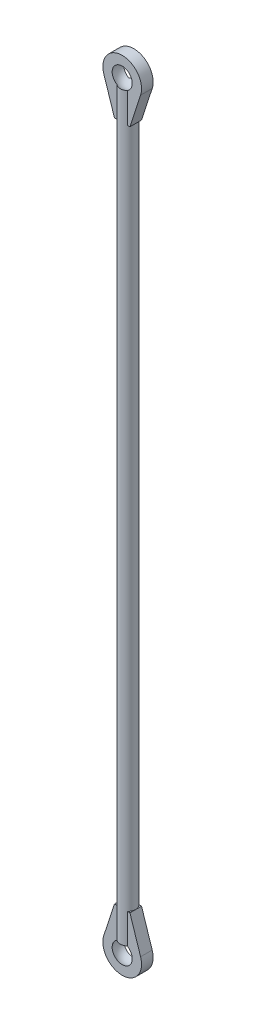
ISO-10303-21;
HEADER;
FILE_DESCRIPTION(('STEP AP214'),'2;1');
FILE_NAME('part.step','',(''),(''),'','','');
FILE_SCHEMA(('AUTOMOTIVE_DESIGN { 1 0 10303 214 1 1 1 1 }'));
ENDSEC;
DATA;
#1=APPLICATION_CONTEXT('core data for automotive mechanical design processes');
#2=APPLICATION_PROTOCOL_DEFINITION('international standard','automotive_design',2000,#1);
#3=PRODUCT_CONTEXT('',#1,'mechanical');
#4=PRODUCT('Part','Part','',(#3));
#5=PRODUCT_RELATED_PRODUCT_CATEGORY('part','',(#4));
#6=PRODUCT_DEFINITION_FORMATION('','',#4);
#7=PRODUCT_DEFINITION_CONTEXT('part definition',#1,'design');
#8=PRODUCT_DEFINITION('design','',#6,#7);
#9=PRODUCT_DEFINITION_SHAPE('','',#8);
#10=(LENGTH_UNIT() NAMED_UNIT(*) SI_UNIT(.MILLI.,.METRE.));
#11=(NAMED_UNIT(*) PLANE_ANGLE_UNIT() SI_UNIT($,.RADIAN.));
#12=(NAMED_UNIT(*) SI_UNIT($,.STERADIAN.) SOLID_ANGLE_UNIT());
#13=UNCERTAINTY_MEASURE_WITH_UNIT(LENGTH_MEASURE(1.E-05),#10,'distance_accuracy_value','');
#14=(GEOMETRIC_REPRESENTATION_CONTEXT(3) GLOBAL_UNCERTAINTY_ASSIGNED_CONTEXT((#13)) GLOBAL_UNIT_ASSIGNED_CONTEXT((#10,
#11,#12)) REPRESENTATION_CONTEXT('',''));
#15=CARTESIAN_POINT('',(0.,0.,0.));
#16=DIRECTION('',(0.,0.,1.));
#17=DIRECTION('',(1.,0.,0.));
#18=AXIS2_PLACEMENT_3D('',#15,#16,#17);
#19=CARTESIAN_POINT('',(0.,-98.,0.));
#20=DIRECTION('',(0.,-1.,0.));
#21=DIRECTION('',(1.,0.,0.));
#22=AXIS2_PLACEMENT_3D('',#19,#20,#21);
#23=CYLINDRICAL_SURFACE('',#22,2.00000000000002);
#24=DIRECTION('',(0.,-1.,0.));
#25=VECTOR('',#24,1.);
#26=CARTESIAN_POINT('',(-1.32287565553233,-98.,-1.5));
#27=LINE('',#26,#25);
#28=CARTESIAN_POINT('',(-1.32287565553237,88.,-1.5));
#29=VERTEX_POINT('',#28);
#30=CARTESIAN_POINT('',(-1.32287565553237,95.7639320225002,-1.5));
#31=VERTEX_POINT('',#30);
#32=EDGE_CURVE('E276',#29,#31,#27,.F.);
#33=ORIENTED_EDGE('',*,*,#32,.T.);
#34=CARTESIAN_POINT('',(0.,95.7639320225002,0.));
#35=DIRECTION('',(0.,0.999999999999999,0.));
#36=DIRECTION('',(-1.,0.,0.));
#37=AXIS2_PLACEMENT_3D('',#34,#35,#36);
#38=CIRCLE('',#37,2.00000000000002);
#39=CARTESIAN_POINT('',(1.3228756555323,95.7639320225002,-1.5));
#40=VERTEX_POINT('',#39);
#41=EDGE_CURVE('E224',#31,#40,#38,.F.);
#42=ORIENTED_EDGE('',*,*,#41,.T.);
#43=DIRECTION('',(0.,-1.,0.));
#44=VECTOR('',#43,1.);
#45=CARTESIAN_POINT('',(1.32287565553233,-98.,-1.5));
#46=LINE('',#45,#44);
#47=CARTESIAN_POINT('',(1.3228756555323,88.,-1.5));
#48=VERTEX_POINT('',#47);
#49=EDGE_CURVE('E270',#40,#48,#46,.T.);
#50=ORIENTED_EDGE('',*,*,#49,.T.);
#51=CARTESIAN_POINT('',(0.,88.,0.));
#52=DIRECTION('',(0.,1.,0.));
#53=DIRECTION('',(0.,0.,1.));
#54=AXIS2_PLACEMENT_3D('',#51,#52,#53);
#55=CIRCLE('',#54,2.00000000000002);
#56=CARTESIAN_POINT('',(2.00000000000002,88.,0.));
#57=VERTEX_POINT('',#56);
#58=EDGE_CURVE('E268',#48,#57,#55,.F.);
#59=ORIENTED_EDGE('',*,*,#58,.T.);
#60=CARTESIAN_POINT('',(1.3228756555323,88.,1.5));
#61=VERTEX_POINT('',#60);
#62=EDGE_CURVE('E265',#57,#61,#55,.F.);
#63=ORIENTED_EDGE('',*,*,#62,.T.);
#64=DIRECTION('',(0.,-1.,0.));
#65=VECTOR('',#64,1.);
#66=CARTESIAN_POINT('',(1.32287565553233,-98.,1.5));
#67=LINE('',#66,#65);
#68=CARTESIAN_POINT('',(1.3228756555323,95.7639320225002,1.5));
#69=VERTEX_POINT('',#68);
#70=EDGE_CURVE('E258',#69,#61,#67,.T.);
#71=ORIENTED_EDGE('',*,*,#70,.F.);
#72=CARTESIAN_POINT('',(-1.32287565553237,95.7639320225002,1.5));
#73=VERTEX_POINT('',#72);
#74=EDGE_CURVE('E220',#69,#73,#38,.F.);
#75=ORIENTED_EDGE('',*,*,#74,.T.);
#76=DIRECTION('',(0.,-1.,0.));
#77=VECTOR('',#76,1.);
#78=CARTESIAN_POINT('',(-1.32287565553233,-98.,1.5));
#79=LINE('',#78,#77);
#80=CARTESIAN_POINT('',(-1.32287565553237,88.,1.5));
#81=VERTEX_POINT('',#80);
#82=EDGE_CURVE('E272',#81,#73,#79,.F.);
#83=ORIENTED_EDGE('',*,*,#82,.F.);
#84=CARTESIAN_POINT('',(-2.00000000000006,88.,0.));
#85=VERTEX_POINT('',#84);
#86=EDGE_CURVE('E275',#81,#85,#55,.F.);
#87=ORIENTED_EDGE('',*,*,#86,.T.);
#88=EDGE_CURVE('E269',#85,#29,#55,.F.);
#89=ORIENTED_EDGE('',*,*,#88,.T.);
#90=EDGE_LOOP('',(#33,#42,#50,#59,#63,#71,#75,#83,#87,#89));
#91=FACE_BOUND('',#90,.T.);
#92=DIRECTION('',(0.,-1.,0.));
#93=VECTOR('',#92,1.);
#94=CARTESIAN_POINT('',(1.32287565553233,-98.,-1.5));
#95=LINE('',#94,#93);
#96=CARTESIAN_POINT('',(1.32287565553233,-88.,-1.5));
#97=VERTEX_POINT('',#96);
#98=CARTESIAN_POINT('',(1.32287565553233,-95.7639320225002,-1.5));
#99=VERTEX_POINT('',#98);
#100=EDGE_CURVE('E202',#97,#99,#95,.T.);
#101=ORIENTED_EDGE('',*,*,#100,.T.);
#102=CARTESIAN_POINT('',(0.,-95.7639320225002,0.));
#103=DIRECTION('',(0.,-0.999999999999999,0.));
#104=DIRECTION('',(1.,0.,0.));
#105=AXIS2_PLACEMENT_3D('',#102,#103,#104);
#106=CIRCLE('',#105,2.00000000000002);
#107=CARTESIAN_POINT('',(-1.32287565553233,-95.7639320225002,-1.5));
#108=VERTEX_POINT('',#107);
#109=EDGE_CURVE('E92',#99,#108,#106,.F.);
#110=ORIENTED_EDGE('',*,*,#109,.T.);
#111=DIRECTION('',(0.,-1.,0.));
#112=VECTOR('',#111,1.);
#113=CARTESIAN_POINT('',(-1.32287565553233,-98.,-1.5));
#114=LINE('',#113,#112);
#115=CARTESIAN_POINT('',(-1.32287565553233,-88.,-1.5));
#116=VERTEX_POINT('',#115);
#117=EDGE_CURVE('E199',#108,#116,#114,.F.);
#118=ORIENTED_EDGE('',*,*,#117,.T.);
#119=CARTESIAN_POINT('',(0.,-88.,0.));
#120=DIRECTION('',(0.,1.,0.));
#121=DIRECTION('',(0.,0.,1.));
#122=AXIS2_PLACEMENT_3D('',#119,#120,#121);
#123=CIRCLE('',#122,2.00000000000002);
#124=CARTESIAN_POINT('',(-2.00000000000003,-87.9999999999999,0.));
#125=VERTEX_POINT('',#124);
#126=EDGE_CURVE('E286',#125,#116,#123,.F.);
#127=ORIENTED_EDGE('',*,*,#126,.F.);
#128=CARTESIAN_POINT('',(-1.32287565553233,-88.,1.5));
#129=VERTEX_POINT('',#128);
#130=EDGE_CURVE('E80',#129,#125,#123,.F.);
#131=ORIENTED_EDGE('',*,*,#130,.F.);
#132=DIRECTION('',(0.,-1.,0.));
#133=VECTOR('',#132,1.);
#134=CARTESIAN_POINT('',(-1.32287565553233,-98.,1.5));
#135=LINE('',#134,#133);
#136=CARTESIAN_POINT('',(-1.32287565553233,-95.7639320225002,1.5));
#137=VERTEX_POINT('',#136);
#138=EDGE_CURVE('E213',#137,#129,#135,.F.);
#139=ORIENTED_EDGE('',*,*,#138,.F.);
#140=CARTESIAN_POINT('',(1.32287565553233,-95.7639320225002,1.5));
#141=VERTEX_POINT('',#140);
#142=EDGE_CURVE('E86',#137,#141,#106,.F.);
#143=ORIENTED_EDGE('',*,*,#142,.T.);
#144=DIRECTION('',(0.,-1.,0.));
#145=VECTOR('',#144,1.);
#146=CARTESIAN_POINT('',(1.32287565553233,-98.,1.5));
#147=LINE('',#146,#145);
#148=CARTESIAN_POINT('',(1.32287565553233,-88.,1.5));
#149=VERTEX_POINT('',#148);
#150=EDGE_CURVE('E210',#149,#141,#147,.T.);
#151=ORIENTED_EDGE('',*,*,#150,.F.);
#152=CARTESIAN_POINT('',(2.00000000000002,-88.,0.));
#153=VERTEX_POINT('',#152);
#154=EDGE_CURVE('E282',#153,#149,#123,.F.);
#155=ORIENTED_EDGE('',*,*,#154,.F.);
#156=EDGE_CURVE('E281',#97,#153,#123,.F.);
#157=ORIENTED_EDGE('',*,*,#156,.F.);
#158=EDGE_LOOP('',(#101,#110,#118,#127,#131,#139,#143,#151,#155,#157));
#159=FACE_BOUND('',#158,.T.);
#160=ADVANCED_FACE('F73',(#91,#159),#23,.T.);
#161=CARTESIAN_POINT('',(0.,88.,1.5));
#162=DIRECTION('',(0.,1.,0.));
#163=DIRECTION('',(0.,0.,1.));
#164=AXIS2_PLACEMENT_3D('',#161,#162,#163);
#165=PLANE('',#164);
#166=ORIENTED_EDGE('',*,*,#86,.F.);
#167=DIRECTION('',(1.,0.,0.));
#168=VECTOR('',#167,1.);
#169=CARTESIAN_POINT('',(0.,88.,1.5));
#170=LINE('',#169,#168);
#171=CARTESIAN_POINT('',(-2.00000000000006,88.,1.5));
#172=VERTEX_POINT('',#171);
#173=EDGE_CURVE('E230',#172,#81,#170,.T.);
#174=ORIENTED_EDGE('',*,*,#173,.F.);
#175=DIRECTION('',(0.,0.,-1.));
#176=VECTOR('',#175,1.);
#177=CARTESIAN_POINT('',(-2.00000000000006,88.,1.5));
#178=LINE('',#177,#176);
#179=EDGE_CURVE('E253',#172,#85,#178,.T.);
#180=ORIENTED_EDGE('',*,*,#179,.T.);
#181=EDGE_LOOP('',(#166,#174,#180));
#182=FACE_BOUND('',#181,.T.);
#183=ADVANCED_FACE('F359',(#182),#165,.F.);
#184=ORIENTED_EDGE('',*,*,#88,.F.);
#185=CARTESIAN_POINT('',(-2.00000000000006,88.,-1.5));
#186=VERTEX_POINT('',#185);
#187=EDGE_CURVE('E252',#85,#186,#178,.T.);
#188=ORIENTED_EDGE('',*,*,#187,.T.);
#189=DIRECTION('',(1.,0.,0.));
#190=VECTOR('',#189,1.);
#191=CARTESIAN_POINT('',(0.,88.,-1.5));
#192=LINE('',#191,#190);
#193=EDGE_CURVE('E242',#186,#29,#192,.T.);
#194=ORIENTED_EDGE('',*,*,#193,.T.);
#195=EDGE_LOOP('',(#184,#188,#194));
#196=FACE_BOUND('',#195,.T.);
#197=ADVANCED_FACE('F364',(#196),#165,.F.);
#198=ORIENTED_EDGE('',*,*,#58,.F.);
#199=CARTESIAN_POINT('',(2.00000000000002,88.,-1.5));
#200=VERTEX_POINT('',#199);
#201=EDGE_CURVE('E240',#48,#200,#192,.T.);
#202=ORIENTED_EDGE('',*,*,#201,.T.);
#203=DIRECTION('',(0.,0.,-1.));
#204=VECTOR('',#203,1.);
#205=CARTESIAN_POINT('',(2.00000000000002,88.,1.5));
#206=LINE('',#205,#204);
#207=EDGE_CURVE('E248',#57,#200,#206,.T.);
#208=ORIENTED_EDGE('',*,*,#207,.F.);
#209=EDGE_LOOP('',(#198,#202,#208));
#210=FACE_BOUND('',#209,.T.);
#211=ADVANCED_FACE('F396',(#210),#165,.F.);
#212=CARTESIAN_POINT('',(24.1163142030769,7.85901549691378,1.5));
#213=DIRECTION('',(0.950787924741885,0.309842415051618,0.));
#214=DIRECTION('',(-0.309842415051618,0.950787924741885,0.));
#215=AXIS2_PLACEMENT_3D('',#212,#213,#214);
#216=PLANE('',#215);
#217=DIRECTION('',(0.309842415051618,-0.950787924741885,0.));
#218=VECTOR('',#217,1.);
#219=CARTESIAN_POINT('',(24.1163142030769,7.85901549691378,-1.5));
#220=LINE('',#219,#218);
#221=CARTESIAN_POINT('',(-4.75393962370943,96.4507879247419,-1.5));
#222=VERTEX_POINT('',#221);
#223=EDGE_CURVE('E237',#222,#186,#220,.T.);
#224=ORIENTED_EDGE('',*,*,#223,.T.);
#225=ORIENTED_EDGE('',*,*,#187,.F.);
#226=ORIENTED_EDGE('',*,*,#179,.F.);
#227=DIRECTION('',(0.309842415051618,-0.950787924741885,0.));
#228=VECTOR('',#227,1.);
#229=CARTESIAN_POINT('',(24.1163142030769,7.85901549691378,1.5));
#230=LINE('',#229,#228);
#231=CARTESIAN_POINT('',(-4.75393962370943,96.4507879247419,1.5));
#232=VERTEX_POINT('',#231);
#233=EDGE_CURVE('E226',#232,#172,#230,.T.);
#234=ORIENTED_EDGE('',*,*,#233,.F.);
#235=DIRECTION('',(0.,0.,-1.));
#236=VECTOR('',#235,1.);
#237=CARTESIAN_POINT('',(-4.75393962370943,96.4507879247419,1.5));
#238=LINE('',#237,#236);
#239=EDGE_CURVE('E256',#232,#222,#238,.T.);
#240=ORIENTED_EDGE('',*,*,#239,.T.);
#241=EDGE_LOOP('',(#224,#225,#226,#234,#240));
#242=FACE_BOUND('',#241,.T.);
#243=ADVANCED_FACE('F381',(#242),#216,.F.);
#244=ORIENTED_EDGE('',*,*,#62,.F.);
#245=CARTESIAN_POINT('',(2.00000000000002,88.,1.5));
#246=VERTEX_POINT('',#245);
#247=EDGE_CURVE('E249',#246,#57,#206,.T.);
#248=ORIENTED_EDGE('',*,*,#247,.F.);
#249=EDGE_CURVE('E228',#61,#246,#170,.T.);
#250=ORIENTED_EDGE('',*,*,#249,.F.);
#251=EDGE_LOOP('',(#244,#248,#250));
#252=FACE_BOUND('',#251,.T.);
#253=ADVANCED_FACE('F367',(#252),#165,.F.);
#254=CARTESIAN_POINT('',(-24.1163142030771,7.85901549691395,1.5));
#255=DIRECTION('',(-0.950787924741884,0.309842415051621,0.));
#256=DIRECTION('',(-0.309842415051621,-0.950787924741884,0.));
#257=AXIS2_PLACEMENT_3D('',#254,#255,#256);
#258=PLANE('',#257);
#259=DIRECTION('',(0.309842415051621,0.950787924741884,0.));
#260=VECTOR('',#259,1.);
#261=CARTESIAN_POINT('',(-24.1163142030771,7.85901549691395,-1.5));
#262=LINE('',#261,#260);
#263=CARTESIAN_POINT('',(4.75393962370942,96.4507879247419,-1.5));
#264=VERTEX_POINT('',#263);
#265=EDGE_CURVE('E229',#200,#264,#262,.T.);
#266=ORIENTED_EDGE('',*,*,#265,.T.);
#267=DIRECTION('',(0.,0.,-1.));
#268=VECTOR('',#267,1.);
#269=CARTESIAN_POINT('',(4.75393962370942,96.4507879247419,1.5));
#270=LINE('',#269,#268);
#271=CARTESIAN_POINT('',(4.75393962370942,96.4507879247419,1.5));
#272=VERTEX_POINT('',#271);
#273=EDGE_CURVE('E236',#272,#264,#270,.T.);
#274=ORIENTED_EDGE('',*,*,#273,.F.);
#275=DIRECTION('',(0.309842415051621,0.950787924741884,0.));
#276=VECTOR('',#275,1.);
#277=CARTESIAN_POINT('',(-24.1163142030771,7.85901549691395,1.5));
#278=LINE('',#277,#276);
#279=EDGE_CURVE('E233',#246,#272,#278,.T.);
#280=ORIENTED_EDGE('',*,*,#279,.F.);
#281=ORIENTED_EDGE('',*,*,#247,.T.);
#282=ORIENTED_EDGE('',*,*,#207,.T.);
#283=EDGE_LOOP('',(#266,#274,#280,#281,#282));
#284=FACE_BOUND('',#283,.T.);
#285=ADVANCED_FACE('F388',(#284),#258,.F.);
#286=CARTESIAN_POINT('',(0.,0.,-1.5));
#287=DIRECTION('',(0.,0.,1.));
#288=DIRECTION('',(1.,0.,0.));
#289=AXIS2_PLACEMENT_3D('',#286,#287,#288);
#290=PLANE('',#289);
#291=CARTESIAN_POINT('',(0.,98.,-1.5));
#292=DIRECTION('',(0.,0.,1.));
#293=DIRECTION('',(1.,0.,0.));
#294=AXIS2_PLACEMENT_3D('',#291,#292,#293);
#295=CIRCLE('',#294,2.59807621135332);
#296=EDGE_CURVE('E223',#31,#40,#295,.F.);
#297=ORIENTED_EDGE('',*,*,#296,.F.);
#298=ORIENTED_EDGE('',*,*,#32,.F.);
#299=ORIENTED_EDGE('',*,*,#193,.F.);
#300=ORIENTED_EDGE('',*,*,#223,.F.);
#301=CARTESIAN_POINT('',(0.,98.,-1.5));
#302=DIRECTION('',(0.,0.,1.));
#303=DIRECTION('',(1.,0.,0.));
#304=AXIS2_PLACEMENT_3D('',#301,#302,#303);
#305=CIRCLE('',#304,5.);
#306=EDGE_CURVE('E261',#264,#222,#305,.T.);
#307=ORIENTED_EDGE('',*,*,#306,.F.);
#308=ORIENTED_EDGE('',*,*,#265,.F.);
#309=ORIENTED_EDGE('',*,*,#201,.F.);
#310=ORIENTED_EDGE('',*,*,#49,.F.);
#311=EDGE_LOOP('',(#297,#298,#299,#300,#307,#308,#309,#310));
#312=FACE_BOUND('',#311,.T.);
#313=ADVANCED_FACE('F375',(#312),#290,.F.);
#314=CARTESIAN_POINT('',(0.,0.,1.5));
#315=DIRECTION('',(0.,0.,1.));
#316=DIRECTION('',(1.,0.,0.));
#317=AXIS2_PLACEMENT_3D('',#314,#315,#316);
#318=PLANE('',#317);
#319=ORIENTED_EDGE('',*,*,#82,.T.);
#320=CARTESIAN_POINT('',(0.,98.,1.5));
#321=DIRECTION('',(0.,0.,1.));
#322=DIRECTION('',(1.,0.,0.));
#323=AXIS2_PLACEMENT_3D('',#320,#321,#322);
#324=CIRCLE('',#323,2.59807621135332);
#325=EDGE_CURVE('E279',#73,#69,#324,.F.);
#326=ORIENTED_EDGE('',*,*,#325,.T.);
#327=ORIENTED_EDGE('',*,*,#70,.T.);
#328=ORIENTED_EDGE('',*,*,#249,.T.);
#329=ORIENTED_EDGE('',*,*,#279,.T.);
#330=CARTESIAN_POINT('',(0.,98.,1.5));
#331=DIRECTION('',(0.,0.,1.));
#332=DIRECTION('',(1.,0.,0.));
#333=AXIS2_PLACEMENT_3D('',#330,#331,#332);
#334=CIRCLE('',#333,5.);
#335=EDGE_CURVE('E241',#272,#232,#334,.T.);
#336=ORIENTED_EDGE('',*,*,#335,.T.);
#337=ORIENTED_EDGE('',*,*,#233,.T.);
#338=ORIENTED_EDGE('',*,*,#173,.T.);
#339=EDGE_LOOP('',(#319,#326,#327,#328,#329,#336,#337,#338));
#340=FACE_BOUND('',#339,.T.);
#341=ADVANCED_FACE('F402',(#340),#318,.T.);
#342=CARTESIAN_POINT('',(0.,98.,1.5));
#343=DIRECTION('',(0.,0.,-1.));
#344=DIRECTION('',(-1.,0.,0.));
#345=AXIS2_PLACEMENT_3D('',#342,#343,#344);
#346=CYLINDRICAL_SURFACE('',#345,5.);
#347=ORIENTED_EDGE('',*,*,#306,.T.);
#348=ORIENTED_EDGE('',*,*,#239,.F.);
#349=ORIENTED_EDGE('',*,*,#335,.F.);
#350=ORIENTED_EDGE('',*,*,#273,.T.);
#351=EDGE_LOOP('',(#347,#348,#349,#350));
#352=FACE_BOUND('',#351,.T.);
#353=ADVANCED_FACE('F406',(#352),#346,.T.);
#354=CARTESIAN_POINT('',(0.,98.,0.));
#355=DIRECTION('',(0.,-1.,0.));
#356=DIRECTION('',(-1.,0.,0.));
#357=AXIS2_PLACEMENT_3D('',#354,#355,#356);
#358=SPHERICAL_SURFACE('',#357,3.);
#359=ORIENTED_EDGE('',*,*,#296,.T.);
#360=ORIENTED_EDGE('',*,*,#41,.F.);
#361=EDGE_LOOP('',(#359,#360));
#362=FACE_BOUND('',#361,.T.);
#363=ORIENTED_EDGE('',*,*,#325,.F.);
#364=ORIENTED_EDGE('',*,*,#74,.F.);
#365=EDGE_LOOP('',(#363,#364));
#366=FACE_BOUND('',#365,.T.);
#367=ADVANCED_FACE('F408',(#362,#366),#358,.F.);
#368=CARTESIAN_POINT('',(0.,-88.,1.5));
#369=DIRECTION('',(0.,1.,0.));
#370=DIRECTION('',(0.,0.,1.));
#371=AXIS2_PLACEMENT_3D('',#368,#369,#370);
#372=PLANE('',#371);
#373=DIRECTION('',(1.,0.,0.));
#374=VECTOR('',#373,1.);
#375=CARTESIAN_POINT('',(0.,-88.,1.5));
#376=LINE('',#375,#374);
#377=CARTESIAN_POINT('',(-2.00000000000006,-88.,1.5));
#378=VERTEX_POINT('',#377);
#379=EDGE_CURVE('E301',#378,#129,#376,.T.);
#380=ORIENTED_EDGE('',*,*,#379,.T.);
#381=ORIENTED_EDGE('',*,*,#130,.T.);
#382=DIRECTION('',(0.,0.,-1.));
#383=VECTOR('',#382,1.);
#384=CARTESIAN_POINT('',(-2.00000000000006,-88.,1.5));
#385=LINE('',#384,#383);
#386=EDGE_CURVE('E304',#378,#125,#385,.T.);
#387=ORIENTED_EDGE('',*,*,#386,.F.);
#388=EDGE_LOOP('',(#380,#381,#387));
#389=FACE_BOUND('',#388,.T.);
#390=ADVANCED_FACE('F303',(#389),#372,.T.);
#391=CARTESIAN_POINT('',(-2.00000000000006,-88.,-1.5));
#392=VERTEX_POINT('',#391);
#393=EDGE_CURVE('E293',#125,#392,#385,.T.);
#394=ORIENTED_EDGE('',*,*,#393,.F.);
#395=ORIENTED_EDGE('',*,*,#126,.T.);
#396=DIRECTION('',(1.,0.,0.));
#397=VECTOR('',#396,1.);
#398=CARTESIAN_POINT('',(0.,-88.,-1.5));
#399=LINE('',#398,#397);
#400=EDGE_CURVE('E209',#392,#116,#399,.T.);
#401=ORIENTED_EDGE('',*,*,#400,.F.);
#402=EDGE_LOOP('',(#394,#395,#401));
#403=FACE_BOUND('',#402,.T.);
#404=ADVANCED_FACE('F292',(#403),#372,.T.);
#405=CARTESIAN_POINT('',(2.00000000000002,-88.,-1.5));
#406=VERTEX_POINT('',#405);
#407=EDGE_CURVE('E316',#97,#406,#399,.T.);
#408=ORIENTED_EDGE('',*,*,#407,.F.);
#409=ORIENTED_EDGE('',*,*,#156,.T.);
#410=DIRECTION('',(0.,0.,-1.));
#411=VECTOR('',#410,1.);
#412=CARTESIAN_POINT('',(2.00000000000002,-88.,1.5));
#413=LINE('',#412,#411);
#414=EDGE_CURVE('E324',#153,#406,#413,.T.);
#415=ORIENTED_EDGE('',*,*,#414,.T.);
#416=EDGE_LOOP('',(#408,#409,#415));
#417=FACE_BOUND('',#416,.T.);
#418=ADVANCED_FACE('F356',(#417),#372,.T.);
#419=CARTESIAN_POINT('',(-24.1163142030771,-7.85901549691395,1.5));
#420=DIRECTION('',(0.950787924741884,0.309842415051621,0.));
#421=DIRECTION('',(-0.309842415051621,0.950787924741884,0.));
#422=AXIS2_PLACEMENT_3D('',#419,#420,#421);
#423=PLANE('',#422);
#424=DIRECTION('',(0.309842415051621,-0.950787924741884,0.));
#425=VECTOR('',#424,1.);
#426=CARTESIAN_POINT('',(-24.1163142030771,-7.85901549691395,-1.5));
#427=LINE('',#426,#425);
#428=CARTESIAN_POINT('',(4.7539396237094,-96.4507879247419,-1.5));
#429=VERTEX_POINT('',#428);
#430=EDGE_CURVE('E314',#406,#429,#427,.T.);
#431=ORIENTED_EDGE('',*,*,#430,.F.);
#432=ORIENTED_EDGE('',*,*,#414,.F.);
#433=CARTESIAN_POINT('',(2.00000000000002,-88.,1.5));
#434=VERTEX_POINT('',#433);
#435=EDGE_CURVE('E325',#434,#153,#413,.T.);
#436=ORIENTED_EDGE('',*,*,#435,.F.);
#437=DIRECTION('',(0.309842415051621,-0.950787924741884,0.));
#438=VECTOR('',#437,1.);
#439=CARTESIAN_POINT('',(-24.1163142030771,-7.85901549691395,1.5));
#440=LINE('',#439,#438);
#441=CARTESIAN_POINT('',(4.75393962370942,-96.4507879247419,1.5));
#442=VERTEX_POINT('',#441);
#443=EDGE_CURVE('E310',#434,#442,#440,.T.);
#444=ORIENTED_EDGE('',*,*,#443,.T.);
#445=DIRECTION('',(0.,0.,-1.));
#446=VECTOR('',#445,1.);
#447=CARTESIAN_POINT('',(4.75393962370942,-96.4507879247419,1.5));
#448=LINE('',#447,#446);
#449=EDGE_CURVE('E215',#442,#429,#448,.T.);
#450=ORIENTED_EDGE('',*,*,#449,.T.);
#451=EDGE_LOOP('',(#431,#432,#436,#444,#450));
#452=FACE_BOUND('',#451,.T.);
#453=ADVANCED_FACE('F332',(#452),#423,.T.);
#454=ORIENTED_EDGE('',*,*,#435,.T.);
#455=ORIENTED_EDGE('',*,*,#154,.T.);
#456=EDGE_CURVE('E306',#149,#434,#376,.T.);
#457=ORIENTED_EDGE('',*,*,#456,.T.);
#458=EDGE_LOOP('',(#454,#455,#457));
#459=FACE_BOUND('',#458,.T.);
#460=ADVANCED_FACE('F347',(#459),#372,.T.);
#461=CARTESIAN_POINT('',(24.1163142030769,-7.85901549691378,1.5));
#462=DIRECTION('',(-0.950787924741885,0.309842415051618,0.));
#463=DIRECTION('',(-0.309842415051618,-0.950787924741885,0.));
#464=AXIS2_PLACEMENT_3D('',#461,#462,#463);
#465=PLANE('',#464);
#466=DIRECTION('',(0.309842415051618,0.950787924741885,0.));
#467=VECTOR('',#466,1.);
#468=CARTESIAN_POINT('',(24.1163142030769,-7.85901549691378,-1.5));
#469=LINE('',#468,#467);
#470=CARTESIAN_POINT('',(-4.75393962370943,-96.4507879247419,-1.5));
#471=VERTEX_POINT('',#470);
#472=EDGE_CURVE('E319',#471,#392,#469,.T.);
#473=ORIENTED_EDGE('',*,*,#472,.F.);
#474=DIRECTION('',(0.,0.,-1.));
#475=VECTOR('',#474,1.);
#476=CARTESIAN_POINT('',(-4.75393962370943,-96.4507879247419,1.5));
#477=LINE('',#476,#475);
#478=CARTESIAN_POINT('',(-4.75393962370943,-96.4507879247419,1.5));
#479=VERTEX_POINT('',#478);
#480=EDGE_CURVE('E308',#479,#471,#477,.T.);
#481=ORIENTED_EDGE('',*,*,#480,.F.);
#482=DIRECTION('',(0.309842415051618,0.950787924741885,0.));
#483=VECTOR('',#482,1.);
#484=CARTESIAN_POINT('',(24.1163142030769,-7.85901549691378,1.5));
#485=LINE('',#484,#483);
#486=EDGE_CURVE('E305',#479,#378,#485,.T.);
#487=ORIENTED_EDGE('',*,*,#486,.T.);
#488=ORIENTED_EDGE('',*,*,#386,.T.);
#489=ORIENTED_EDGE('',*,*,#393,.T.);
#490=EDGE_LOOP('',(#473,#481,#487,#488,#489));
#491=FACE_BOUND('',#490,.T.);
#492=ADVANCED_FACE('F345',(#491),#465,.T.);
#493=CARTESIAN_POINT('',(0.,0.,1.5));
#494=DIRECTION('',(0.,0.,1.));
#495=DIRECTION('',(1.,0.,0.));
#496=AXIS2_PLACEMENT_3D('',#493,#494,#495);
#497=PLANE('',#496);
#498=ORIENTED_EDGE('',*,*,#150,.T.);
#499=CARTESIAN_POINT('',(0.,-98.,1.5));
#500=DIRECTION('',(0.,0.,1.));
#501=DIRECTION('',(1.,0.,0.));
#502=AXIS2_PLACEMENT_3D('',#499,#500,#501);
#503=CIRCLE('',#502,2.59807621135332);
#504=EDGE_CURVE('E203',#141,#137,#503,.F.);
#505=ORIENTED_EDGE('',*,*,#504,.T.);
#506=ORIENTED_EDGE('',*,*,#138,.T.);
#507=ORIENTED_EDGE('',*,*,#379,.F.);
#508=ORIENTED_EDGE('',*,*,#486,.F.);
#509=CARTESIAN_POINT('',(0.,-98.,1.5));
#510=DIRECTION('',(0.,0.,-1.));
#511=DIRECTION('',(1.,0.,0.));
#512=AXIS2_PLACEMENT_3D('',#509,#510,#511);
#513=CIRCLE('',#512,5.);
#514=EDGE_CURVE('E317',#442,#479,#513,.T.);
#515=ORIENTED_EDGE('',*,*,#514,.F.);
#516=ORIENTED_EDGE('',*,*,#443,.F.);
#517=ORIENTED_EDGE('',*,*,#456,.F.);
#518=EDGE_LOOP('',(#498,#505,#506,#507,#508,#515,#516,#517));
#519=FACE_BOUND('',#518,.T.);
#520=ADVANCED_FACE('F299',(#519),#497,.T.);
#521=CARTESIAN_POINT('',(0.,0.,-1.5));
#522=DIRECTION('',(0.,0.,1.));
#523=DIRECTION('',(1.,0.,0.));
#524=AXIS2_PLACEMENT_3D('',#521,#522,#523);
#525=PLANE('',#524);
#526=CARTESIAN_POINT('',(0.,-98.,-1.5));
#527=DIRECTION('',(0.,0.,1.));
#528=DIRECTION('',(1.,0.,0.));
#529=AXIS2_PLACEMENT_3D('',#526,#527,#528);
#530=CIRCLE('',#529,2.59807621135332);
#531=EDGE_CURVE('E12',#99,#108,#530,.F.);
#532=ORIENTED_EDGE('',*,*,#531,.F.);
#533=ORIENTED_EDGE('',*,*,#100,.F.);
#534=ORIENTED_EDGE('',*,*,#407,.T.);
#535=ORIENTED_EDGE('',*,*,#430,.T.);
#536=CARTESIAN_POINT('',(0.,-98.,-1.5));
#537=DIRECTION('',(0.,0.,-1.));
#538=DIRECTION('',(1.,0.,0.));
#539=AXIS2_PLACEMENT_3D('',#536,#537,#538);
#540=CIRCLE('',#539,5.);
#541=EDGE_CURVE('E339',#429,#471,#540,.T.);
#542=ORIENTED_EDGE('',*,*,#541,.T.);
#543=ORIENTED_EDGE('',*,*,#472,.T.);
#544=ORIENTED_EDGE('',*,*,#400,.T.);
#545=ORIENTED_EDGE('',*,*,#117,.F.);
#546=EDGE_LOOP('',(#532,#533,#534,#535,#542,#543,#544,#545));
#547=FACE_BOUND('',#546,.T.);
#548=ADVANCED_FACE('F206',(#547),#525,.F.);
#549=CARTESIAN_POINT('',(0.,-98.,1.5));
#550=DIRECTION('',(0.,0.,-1.));
#551=DIRECTION('',(-1.,0.,0.));
#552=AXIS2_PLACEMENT_3D('',#549,#550,#551);
#553=CYLINDRICAL_SURFACE('',#552,5.);
#554=ORIENTED_EDGE('',*,*,#449,.F.);
#555=ORIENTED_EDGE('',*,*,#514,.T.);
#556=ORIENTED_EDGE('',*,*,#480,.T.);
#557=ORIENTED_EDGE('',*,*,#541,.F.);
#558=EDGE_LOOP('',(#554,#555,#556,#557));
#559=FACE_BOUND('',#558,.T.);
#560=ADVANCED_FACE('F340',(#559),#553,.T.);
#561=CARTESIAN_POINT('',(0.,-98.,0.));
#562=DIRECTION('',(0.,1.,0.));
#563=DIRECTION('',(-1.,0.,0.));
#564=AXIS2_PLACEMENT_3D('',#561,#562,#563);
#565=SPHERICAL_SURFACE('',#564,3.);
#566=ORIENTED_EDGE('',*,*,#504,.F.);
#567=ORIENTED_EDGE('',*,*,#142,.F.);
#568=EDGE_LOOP('',(#566,#567));
#569=FACE_BOUND('',#568,.T.);
#570=ORIENTED_EDGE('',*,*,#531,.T.);
#571=ORIENTED_EDGE('',*,*,#109,.F.);
#572=EDGE_LOOP('',(#570,#571));
#573=FACE_BOUND('',#572,.T.);
#574=ADVANCED_FACE('F193',(#569,#573),#565,.F.);
#575=CLOSED_SHELL('',(#160,#183,#197,#211,#243,#253,#285,#313,#341,#353,#367,#390,#404,#418,
#453,#460,#492,#520,#548,#560,#574));
#576=MANIFOLD_SOLID_BREP('B2',#575);
#577=ADVANCED_BREP_SHAPE_REPRESENTATION('',(#18,#576),#14);
#578=SHAPE_DEFINITION_REPRESENTATION(#9,#577);
ENDSEC;
END-ISO-10303-21;
